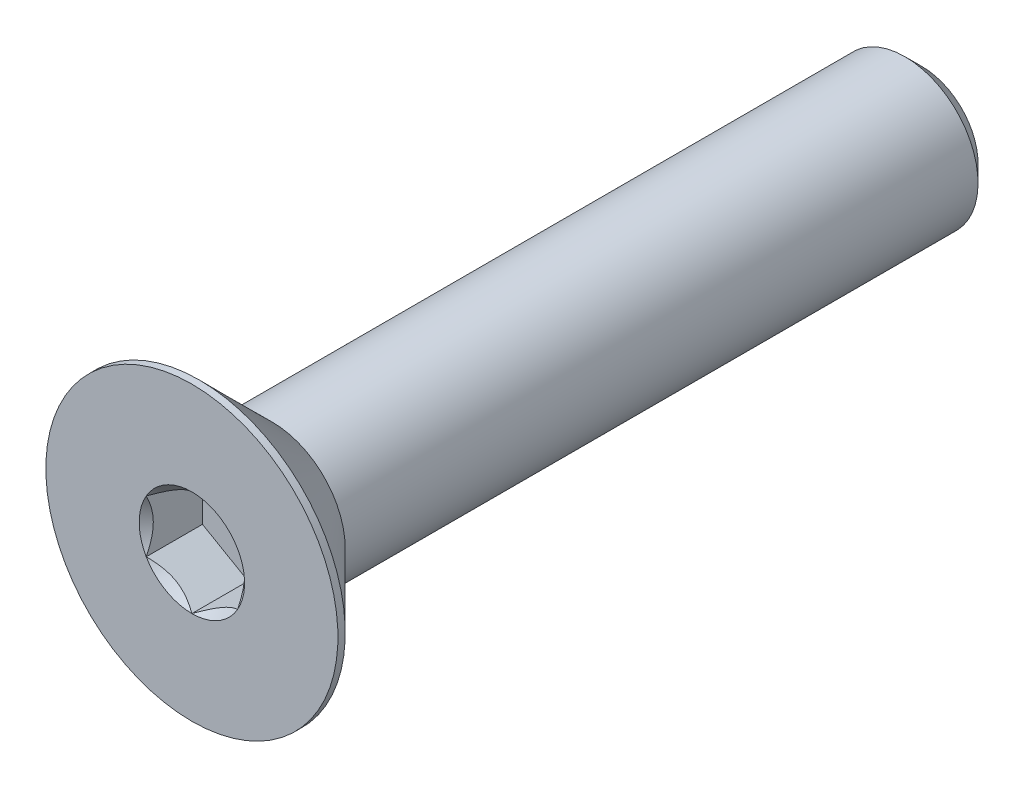
ISO-10303-21;
HEADER;
FILE_DESCRIPTION(('STEP AP214'),'2;1');
FILE_NAME('part.step','',(''),(''),'','','');
FILE_SCHEMA(('AUTOMOTIVE_DESIGN { 1 0 10303 214 1 1 1 1 }'));
ENDSEC;
DATA;
#1=APPLICATION_CONTEXT('core data for automotive mechanical design processes');
#2=APPLICATION_PROTOCOL_DEFINITION('international standard','automotive_design',2000,#1);
#3=PRODUCT_CONTEXT('',#1,'mechanical');
#4=PRODUCT('Part','Part','',(#3));
#5=PRODUCT_RELATED_PRODUCT_CATEGORY('part','',(#4));
#6=PRODUCT_DEFINITION_FORMATION('','',#4);
#7=PRODUCT_DEFINITION_CONTEXT('part definition',#1,'design');
#8=PRODUCT_DEFINITION('design','',#6,#7);
#9=PRODUCT_DEFINITION_SHAPE('','',#8);
#10=(LENGTH_UNIT() NAMED_UNIT(*) SI_UNIT(.MILLI.,.METRE.));
#11=(NAMED_UNIT(*) PLANE_ANGLE_UNIT() SI_UNIT($,.RADIAN.));
#12=(NAMED_UNIT(*) SI_UNIT($,.STERADIAN.) SOLID_ANGLE_UNIT());
#13=UNCERTAINTY_MEASURE_WITH_UNIT(LENGTH_MEASURE(1.E-05),#10,'distance_accuracy_value','');
#14=(GEOMETRIC_REPRESENTATION_CONTEXT(3) GLOBAL_UNCERTAINTY_ASSIGNED_CONTEXT((#13)) GLOBAL_UNIT_ASSIGNED_CONTEXT((#10,
#11,#12)) REPRESENTATION_CONTEXT('',''));
#15=CARTESIAN_POINT('',(0.,0.,0.));
#16=DIRECTION('',(0.,0.,1.));
#17=DIRECTION('',(1.,0.,0.));
#18=AXIS2_PLACEMENT_3D('',#15,#16,#17);
#19=CARTESIAN_POINT('',(0.,0.,-40.));
#20=DIRECTION('',(0.,0.,-1.));
#21=DIRECTION('',(0.,1.,0.));
#22=AXIS2_PLACEMENT_3D('',#19,#20,#21);
#23=CYLINDRICAL_SURFACE('',#22,4.);
#24=CARTESIAN_POINT('',(0.,0.,-39.0625));
#25=DIRECTION('',(0.,0.,-1.));
#26=DIRECTION('',(0.,1.,0.));
#27=AXIS2_PLACEMENT_3D('',#24,#25,#26);
#28=CIRCLE('',#27,4.);
#29=CARTESIAN_POINT('',(0.,4.,-39.0625));
#30=VERTEX_POINT('',#29);
#31=EDGE_CURVE('E51',#30,#30,#28,.F.);
#32=ORIENTED_EDGE('',*,*,#31,.T.);
#33=EDGE_LOOP('',(#32));
#34=FACE_BOUND('',#33,.T.);
#35=CARTESIAN_POINT('',(0.,0.,-4.4));
#36=DIRECTION('',(0.,0.,1.));
#37=DIRECTION('',(0.,-1.,0.));
#38=AXIS2_PLACEMENT_3D('',#35,#36,#37);
#39=CIRCLE('',#38,4.00000000000001);
#40=CARTESIAN_POINT('',(0.,-4.00000000000001,-4.39999999999999));
#41=VERTEX_POINT('',#40);
#42=EDGE_CURVE('E169',#41,#41,#39,.T.);
#43=ORIENTED_EDGE('',*,*,#42,.F.);
#44=EDGE_LOOP('',(#43));
#45=FACE_BOUND('',#44,.T.);
#46=ADVANCED_FACE('F37',(#34,#45),#23,.T.);
#47=CARTESIAN_POINT('',(0.,-4.,-40.));
#48=DIRECTION('',(0.,0.,-1.));
#49=DIRECTION('',(0.,1.,0.));
#50=AXIS2_PLACEMENT_3D('',#47,#48,#49);
#51=PLANE('',#50);
#52=CARTESIAN_POINT('',(0.,0.,-40.));
#53=DIRECTION('',(0.,0.,-1.));
#54=DIRECTION('',(0.,1.,0.));
#55=AXIS2_PLACEMENT_3D('',#52,#53,#54);
#56=CIRCLE('',#55,3.0625);
#57=CARTESIAN_POINT('',(0.,3.0625,-40.));
#58=VERTEX_POINT('',#57);
#59=EDGE_CURVE('E178',#58,#58,#56,.T.);
#60=ORIENTED_EDGE('',*,*,#59,.T.);
#61=EDGE_LOOP('',(#60));
#62=FACE_BOUND('',#61,.T.);
#63=ADVANCED_FACE('F188',(#62),#51,.T.);
#64=CARTESIAN_POINT('',(0.,0.,-40.));
#65=DIRECTION('',(0.,0.,1.));
#66=DIRECTION('',(0.,-1.,0.));
#67=AXIS2_PLACEMENT_3D('',#64,#65,#66);
#68=CONICAL_SURFACE('',#67,3.0625,0.785398163397445);
#69=ORIENTED_EDGE('',*,*,#31,.F.);
#70=EDGE_LOOP('',(#69));
#71=FACE_BOUND('',#70,.T.);
#72=ORIENTED_EDGE('',*,*,#59,.F.);
#73=EDGE_LOOP('',(#72));
#74=FACE_BOUND('',#73,.T.);
#75=ADVANCED_FACE('F39',(#71,#74),#68,.T.);
#76=CARTESIAN_POINT('',(0.,0.,0.));
#77=DIRECTION('',(0.,0.,1.));
#78=DIRECTION('',(0.,-1.,0.));
#79=AXIS2_PLACEMENT_3D('',#76,#77,#78);
#80=CYLINDRICAL_SURFACE('',#79,8.);
#81=CARTESIAN_POINT('',(0.,0.,0.));
#82=DIRECTION('',(0.,0.,1.));
#83=DIRECTION('',(0.,-1.,0.));
#84=AXIS2_PLACEMENT_3D('',#81,#82,#83);
#85=CIRCLE('',#84,8.);
#86=CARTESIAN_POINT('',(0.,-8.,0.));
#87=VERTEX_POINT('',#86);
#88=EDGE_CURVE('E175',#87,#87,#85,.T.);
#89=ORIENTED_EDGE('',*,*,#88,.F.);
#90=EDGE_LOOP('',(#89));
#91=FACE_BOUND('',#90,.T.);
#92=CARTESIAN_POINT('',(0.,0.,-0.400000000000014));
#93=DIRECTION('',(0.,0.,1.));
#94=DIRECTION('',(0.,-1.,0.));
#95=AXIS2_PLACEMENT_3D('',#92,#93,#94);
#96=CIRCLE('',#95,8.);
#97=CARTESIAN_POINT('',(0.,-8.,-0.400000000000006));
#98=VERTEX_POINT('',#97);
#99=EDGE_CURVE('E172',#98,#98,#96,.T.);
#100=ORIENTED_EDGE('',*,*,#99,.T.);
#101=EDGE_LOOP('',(#100));
#102=FACE_BOUND('',#101,.T.);
#103=ADVANCED_FACE('F187',(#91,#102),#80,.T.);
#104=CARTESIAN_POINT('',(0.,0.,-4.4));
#105=DIRECTION('',(0.,0.,1.));
#106=DIRECTION('',(0.,-1.,0.));
#107=AXIS2_PLACEMENT_3D('',#104,#105,#106);
#108=CONICAL_SURFACE('',#107,4.00000000000001,0.785398163397449);
#109=ORIENTED_EDGE('',*,*,#99,.F.);
#110=EDGE_LOOP('',(#109));
#111=FACE_BOUND('',#110,.T.);
#112=ORIENTED_EDGE('',*,*,#42,.T.);
#113=EDGE_LOOP('',(#112));
#114=FACE_BOUND('',#113,.T.);
#115=ADVANCED_FACE('F198',(#111,#114),#108,.T.);
#116=CARTESIAN_POINT('',(0.,-4.,0.));
#117=DIRECTION('',(0.,0.,1.));
#118=DIRECTION('',(0.,-1.,0.));
#119=AXIS2_PLACEMENT_3D('',#116,#117,#118);
#120=PLANE('',#119);
#121=CARTESIAN_POINT('',(0.,0.,0.));
#122=DIRECTION('',(0.,0.,1.));
#123=DIRECTION('',(1.,0.,0.));
#124=AXIS2_PLACEMENT_3D('',#121,#122,#123);
#125=CIRCLE('',#124,2.88675134594813);
#126=CARTESIAN_POINT('',(0.,-2.88675134594813,0.));
#127=VERTEX_POINT('',#126);
#128=CARTESIAN_POINT('',(2.5,-1.44337567297407,0.));
#129=VERTEX_POINT('',#128);
#130=EDGE_CURVE('E97',#127,#129,#125,.T.);
#131=ORIENTED_EDGE('',*,*,#130,.F.);
#132=CARTESIAN_POINT('',(-2.5,-1.44337567297406,0.));
#133=VERTEX_POINT('',#132);
#134=EDGE_CURVE('E57',#133,#127,#125,.T.);
#135=ORIENTED_EDGE('',*,*,#134,.F.);
#136=CARTESIAN_POINT('',(-2.5,1.44337567297407,0.));
#137=VERTEX_POINT('',#136);
#138=EDGE_CURVE('E139',#137,#133,#125,.T.);
#139=ORIENTED_EDGE('',*,*,#138,.F.);
#140=CARTESIAN_POINT('',(0.,2.88675134594813,0.));
#141=VERTEX_POINT('',#140);
#142=EDGE_CURVE('E64',#141,#137,#125,.T.);
#143=ORIENTED_EDGE('',*,*,#142,.F.);
#144=CARTESIAN_POINT('',(2.5,1.44337567297407,0.));
#145=VERTEX_POINT('',#144);
#146=EDGE_CURVE('E133',#145,#141,#125,.T.);
#147=ORIENTED_EDGE('',*,*,#146,.F.);
#148=EDGE_CURVE('E105',#129,#145,#125,.T.);
#149=ORIENTED_EDGE('',*,*,#148,.F.);
#150=EDGE_LOOP('',(#131,#135,#139,#143,#147,#149));
#151=FACE_BOUND('',#150,.T.);
#152=ORIENTED_EDGE('',*,*,#88,.T.);
#153=EDGE_LOOP('',(#152));
#154=FACE_BOUND('',#153,.T.);
#155=ADVANCED_FACE('F131',(#151,#154),#120,.T.);
#156=CARTESIAN_POINT('',(0.,0.,0.));
#157=DIRECTION('',(0.,0.,1.));
#158=DIRECTION('',(1.,0.,0.));
#159=AXIS2_PLACEMENT_3D('',#156,#157,#158);
#160=CONICAL_SURFACE('',#159,2.88675134594813,0.78539816339745);
#161=ORIENTED_EDGE('',*,*,#148,.T.);
#162=CARTESIAN_POINT('',(2.5,-2.87868021616155,0.925964193784654));
#163=CARTESIAN_POINT('',(2.5,-2.80858751756355,0.873054769399493));
#164=CARTESIAN_POINT('',(2.5,-2.73810237384458,0.820656784806447));
#165=CARTESIAN_POINT('',(2.5,-2.5961923890747,0.71711268351522));
#166=CARTESIAN_POINT('',(2.5,-2.52476731657143,0.665966884377933));
#167=CARTESIAN_POINT('',(2.5,-2.38030019419698,0.564792497981435));
#168=CARTESIAN_POINT('',(2.5,-2.307249903594,0.514775637784461));
#169=CARTESIAN_POINT('',(2.5,-2.15990937397294,0.416608843915507));
#170=CARTESIAN_POINT('',(2.5,-2.08561922308943,0.368458778345536));
#171=CARTESIAN_POINT('',(2.5,-1.93130274871409,0.271746559451961));
#172=CARTESIAN_POINT('',(2.5,-1.8511916849785,0.223318932537291));
#173=CARTESIAN_POINT('',(2.5,-1.68912282627168,0.129664059704143));
#174=CARTESIAN_POINT('',(2.5,-1.60716527674864,0.0844363916948275));
#175=CARTESIAN_POINT('',(2.5,-1.44137668632319,-0.00186462533073079));
#176=CARTESIAN_POINT('',(2.5,-1.35755175925796,-0.0429496273364141));
#177=CARTESIAN_POINT('',(2.5,-1.18761577759421,-0.120038133893406));
#178=CARTESIAN_POINT('',(2.5,-1.10150577924729,-0.156043939265442));
#179=CARTESIAN_POINT('',(2.5,-0.933895283730375,-0.219050255714909));
#180=CARTESIAN_POINT('',(2.5,-0.852581486652413,-0.246542279856904));
#181=CARTESIAN_POINT('',(2.5,-0.687996185051426,-0.295002885582604));
#182=CARTESIAN_POINT('',(2.5,-0.604724546085164,-0.315971017761044));
#183=CARTESIAN_POINT('',(2.5,-0.43810578650165,-0.34994000498697));
#184=CARTESIAN_POINT('',(2.5,-0.354786957377882,-0.36307736655639));
#185=CARTESIAN_POINT('',(2.5,-0.187258638268772,-0.381129805600403));
#186=CARTESIAN_POINT('',(2.5,-0.103049303891733,-0.386046296469838));
#187=CARTESIAN_POINT('',(2.5,0.0623819458555491,-0.387291925628103));
#188=CARTESIAN_POINT('',(2.5,0.143601667742494,-0.383925448289118));
#189=CARTESIAN_POINT('',(2.5,0.305344840533964,-0.369462407619086));
#190=CARTESIAN_POINT('',(2.5,0.385868223029657,-0.358365093346909));
#191=CARTESIAN_POINT('',(2.5,0.54699999247773,-0.328857921414663));
#192=CARTESIAN_POINT('',(2.5,0.627585258156379,-0.310323623169082));
#193=CARTESIAN_POINT('',(2.5,0.786991930978587,-0.266927667985934));
#194=CARTESIAN_POINT('',(2.5,0.865813485110824,-0.242066540482563));
#195=CARTESIAN_POINT('',(2.5,1.11399280220491,-0.154441088760137));
#196=CARTESIAN_POINT('',(2.5,1.27984027529456,-0.0816966645253849));
#197=CARTESIAN_POINT('',(2.5,1.52253018655038,0.0395423452678429));
#198=CARTESIAN_POINT('',(2.5,1.60256472908879,0.0820714512072025));
#199=CARTESIAN_POINT('',(2.5,1.76081489282124,0.170396524152191));
#200=CARTESIAN_POINT('',(2.5,1.83903083842887,0.216191902476711));
#201=CARTESIAN_POINT('',(2.5,1.99000684607168,0.308044678728647));
#202=CARTESIAN_POINT('',(2.5,2.06284472030444,0.353975635424457));
#203=CARTESIAN_POINT('',(2.5,2.20727164736135,0.447770245386505));
#204=CARTESIAN_POINT('',(2.5,2.27886060500402,0.495634045043618));
#205=CARTESIAN_POINT('',(2.5,2.42037078548403,0.592552236318333));
#206=CARTESIAN_POINT('',(2.5,2.49030083172878,0.641593798316209));
#207=CARTESIAN_POINT('',(2.5,2.62920524991558,0.74097383518978));
#208=CARTESIAN_POINT('',(2.5,2.69817987937839,0.791311949707407));
#209=CARTESIAN_POINT('',(2.5,2.76675463365823,0.842180297682425));
#210=B_SPLINE_CURVE_WITH_KNOTS('',3,(#162,#163,#164,#165,#166,#167,#168,#169,#170,#171,#172,
#173,#174,#175,#176,#177,#178,#179,#180,#181,#182,#183,#184,#185,#186,#187,#188,#189,#190,#191,
#192,#193,#194,#195,#196,#197,#198,#199,#200,#201,#202,#203,#204,#205,#206,#207,#208,#209),
.UNSPECIFIED.,.F.,.F.,(4,2,2,2,2,2,2,2,2,2,2,2,2,2,2,2,2,2,2,2,2,2,2,4),(0.,0.263465914971114,
0.526997968323237,0.792571943279361,1.05812711983771,1.33890112548018,1.61963802629079,
1.89956181222216,2.17935838571897,2.436638876826,2.69393708705248,2.94660788173135,
3.19923523085016,3.44271854486786,3.68622551313359,3.93398926860573,4.18173229781968,
4.72334004841908,4.99521600382014,5.26704308216966,5.52534341671993,5.78366335141086,
6.03988492204047,6.29603603207541),.UNSPECIFIED.);
#211=EDGE_CURVE('E11',#129,#145,#210,.T.);
#212=ORIENTED_EDGE('',*,*,#211,.F.);
#213=EDGE_LOOP('',(#161,#212));
#214=FACE_BOUND('',#213,.T.);
#215=ADVANCED_FACE('F109',(#214),#160,.F.);
#216=ORIENTED_EDGE('',*,*,#146,.T.);
#217=CARTESIAN_POINT('',(2.5002,1.44326020292023,0.000115476981763761));
#218=CARTESIAN_POINT('',(2.41426172221224,1.49287669073469,-0.049459294645273));
#219=CARTESIAN_POINT('',(2.32688643272425,1.5433228376411,-0.0961225186374943));
#220=CARTESIAN_POINT('',(2.14871854383441,1.64618811625259,-0.181561859961699));
#221=CARTESIAN_POINT('',(2.05790899931893,1.6986170312236,-0.220290437593998));
#222=CARTESIAN_POINT('',(1.87479587687308,1.80433744175986,-0.286633296102261));
#223=CARTESIAN_POINT('',(1.78253893547066,1.85760201171316,-0.314414331469144));
#224=CARTESIAN_POINT('',(1.59599399122371,1.96530378549009,-0.357216824089333));
#225=CARTESIAN_POINT('',(1.50171168743372,2.01973769896307,-0.372270233328655));
#226=CARTESIAN_POINT('',(1.33922174170816,2.11355131286833,-0.385852277790517));
#227=CARTESIAN_POINT('',(1.27122403211985,2.15280980880341,-0.387862900759198));
#228=CARTESIAN_POINT('',(1.13533975883078,2.23126263056549,-0.384475882812511));
#229=CARTESIAN_POINT('',(1.06745324244776,2.27045692907358,-0.379075644700179));
#230=CARTESIAN_POINT('',(0.932321211763894,2.34847544336505,-0.361174211597527));
#231=CARTESIAN_POINT('',(0.86507650024644,2.38729919566123,-0.348665072953518));
#232=CARTESIAN_POINT('',(0.731749899181801,2.46427534467604,-0.317232498044292));
#233=CARTESIAN_POINT('',(0.665667920900343,2.50242779262542,-0.298309553503181));
#234=CARTESIAN_POINT('',(0.496403653308736,2.60015256308362,-0.242132638591752));
#235=CARTESIAN_POINT('',(0.394270877777108,2.65911894852989,-0.200644168403812));
#236=CARTESIAN_POINT('',(0.244093585059492,2.74582384890657,-0.130605953276912));
#237=CARTESIAN_POINT('',(0.194603460117391,2.77439698586412,-0.105997747883926));
#238=CARTESIAN_POINT('',(0.0965399361611537,2.83101398781794,-0.0545381132847644));
#239=CARTESIAN_POINT('',(0.0479659965030725,2.85905816495513,-0.0276880612206441));
#240=CARTESIAN_POINT('',(-0.000199999999999359,2.88686681600197,0.00011547698176382));
#241=B_SPLINE_CURVE_WITH_KNOTS('',3,(#217,#218,#219,#220,#221,#222,#223,#224,#225,#226,#227,
#228,#229,#230,#231,#232,#233,#234,#235,#236,#237,#238,#239,#240),.UNSPECIFIED.,.F.,.F.,(4,2,2,
2,2,2,2,2,2,2,2,4),(0.,0.333012085133924,0.667964518301397,0.997597032043298,1.32639954393844,
1.56169424147168,1.79707142102083,2.03271213522171,2.26833478775651,2.64260240809533,
2.82922877818864,3.01574133749025),.UNSPECIFIED.);
#242=EDGE_CURVE('E135',#145,#141,#241,.T.);
#243=ORIENTED_EDGE('',*,*,#242,.F.);
#244=EDGE_LOOP('',(#216,#243));
#245=FACE_BOUND('',#244,.T.);
#246=ADVANCED_FACE('F279',(#245),#160,.F.);
#247=ORIENTED_EDGE('',*,*,#142,.T.);
#248=CARTESIAN_POINT('',(0.00020000000000028,2.88686681600197,0.000115476981764065));
#249=CARTESIAN_POINT('',(-0.0857382777877646,2.83725032818751,-0.0494592946452729));
#250=CARTESIAN_POINT('',(-0.173113567275753,2.7868041812811,-0.0961225186374941));
#251=CARTESIAN_POINT('',(-0.351281456165588,2.6839389026696,-0.181561859961699));
#252=CARTESIAN_POINT('',(-0.442091000681074,2.6315099876986,-0.220290437593997));
#253=CARTESIAN_POINT('',(-0.62520412312692,2.52578957716234,-0.286633296102261));
#254=CARTESIAN_POINT('',(-0.71746106452934,2.47252500720904,-0.314414331469143));
#255=CARTESIAN_POINT('',(-0.904006008776286,2.3648232334321,-0.357216824089333));
#256=CARTESIAN_POINT('',(-0.998288312566283,2.31038931995913,-0.372270233328655));
#257=CARTESIAN_POINT('',(-1.16077825829185,2.21657570605387,-0.385852277790517));
#258=CARTESIAN_POINT('',(-1.22877596788015,2.17731721011878,-0.387862900759198));
#259=CARTESIAN_POINT('',(-1.36466024116922,2.0988643883567,-0.384475882812511));
#260=CARTESIAN_POINT('',(-1.43254675755224,2.05967008984862,-0.379075644700178));
#261=CARTESIAN_POINT('',(-1.5676787882361,1.98165157555715,-0.361174211597527));
#262=CARTESIAN_POINT('',(-1.63492349975356,1.94282782326097,-0.348665072953518));
#263=CARTESIAN_POINT('',(-1.7682501008182,1.86585167424616,-0.317232498044292));
#264=CARTESIAN_POINT('',(-1.83433207909966,1.82769922629678,-0.298309553503181));
#265=CARTESIAN_POINT('',(-2.00359634669126,1.72997445583858,-0.242132638591752));
#266=CARTESIAN_POINT('',(-2.10572912222289,1.67100807039231,-0.200644168403812));
#267=CARTESIAN_POINT('',(-2.25590641494051,1.58430317001562,-0.130605953276911));
#268=CARTESIAN_POINT('',(-2.30539653988261,1.55573003305807,-0.105997747883925));
#269=CARTESIAN_POINT('',(-2.40346006383885,1.49911303110426,-0.0545381132847639));
#270=CARTESIAN_POINT('',(-2.45203400349693,1.47106885396706,-0.0276880612206436));
#271=CARTESIAN_POINT('',(-2.5002,1.44326020292023,0.00011547698176428));
#272=B_SPLINE_CURVE_WITH_KNOTS('',3,(#248,#249,#250,#251,#252,#253,#254,#255,#256,#257,#258,
#259,#260,#261,#262,#263,#264,#265,#266,#267,#268,#269,#270,#271),.UNSPECIFIED.,.F.,.F.,(4,2,2,
2,2,2,2,2,2,2,2,4),(0.,0.333012085133924,0.667964518301397,0.997597032043299,1.32639954393844,
1.56169424147169,1.79707142102083,2.03271213522171,2.2683347877565,2.64260240809533,
2.82922877818864,3.01574133749025),.UNSPECIFIED.);
#273=EDGE_CURVE('E138',#141,#137,#272,.T.);
#274=ORIENTED_EDGE('',*,*,#273,.F.);
#275=EDGE_LOOP('',(#247,#274));
#276=FACE_BOUND('',#275,.T.);
#277=ADVANCED_FACE('F275',(#276),#160,.F.);
#278=ORIENTED_EDGE('',*,*,#138,.T.);
#279=CARTESIAN_POINT('',(-2.5,-2.87868021616154,0.925964193784654));
#280=CARTESIAN_POINT('',(-2.5,-2.80858751756355,0.873054769399494));
#281=CARTESIAN_POINT('',(-2.5,-2.73810237384458,0.820656784806447));
#282=CARTESIAN_POINT('',(-2.5,-2.59619238907469,0.71711268351522));
#283=CARTESIAN_POINT('',(-2.5,-2.52476731657143,0.665966884377933));
#284=CARTESIAN_POINT('',(-2.5,-2.38030019419698,0.564792497981435));
#285=CARTESIAN_POINT('',(-2.5,-2.307249903594,0.514775637784462));
#286=CARTESIAN_POINT('',(-2.5,-2.15990937397294,0.416608843915508));
#287=CARTESIAN_POINT('',(-2.5,-2.08561922308943,0.368458778345537));
#288=CARTESIAN_POINT('',(-2.5,-1.93130274871409,0.271746559451961));
#289=CARTESIAN_POINT('',(-2.5,-1.8511916849785,0.223318932537292));
#290=CARTESIAN_POINT('',(-2.5,-1.68912282627168,0.129664059704144));
#291=CARTESIAN_POINT('',(-2.5,-1.60716527674864,0.0844363916948283));
#292=CARTESIAN_POINT('',(-2.5,-1.44137668632319,-0.00186462533072997));
#293=CARTESIAN_POINT('',(-2.5,-1.35755175925796,-0.0429496273364133));
#294=CARTESIAN_POINT('',(-2.5,-1.1876157775942,-0.120038133893405));
#295=CARTESIAN_POINT('',(-2.5,-1.10150577924729,-0.156043939265441));
#296=CARTESIAN_POINT('',(-2.5,-0.933895283730374,-0.219050255714908));
#297=CARTESIAN_POINT('',(-2.5,-0.852581486652411,-0.246542279856903));
#298=CARTESIAN_POINT('',(-2.5,-0.687996185051425,-0.295002885582602));
#299=CARTESIAN_POINT('',(-2.5,-0.604724546085162,-0.315971017761042));
#300=CARTESIAN_POINT('',(-2.5,-0.438105786501648,-0.349940004986968));
#301=CARTESIAN_POINT('',(-2.5,-0.35478695737788,-0.363077366556388));
#302=CARTESIAN_POINT('',(-2.5,-0.187258638268771,-0.381129805600401));
#303=CARTESIAN_POINT('',(-2.5,-0.103049303891732,-0.386046296469837));
#304=CARTESIAN_POINT('',(-2.5,0.06238194585555,-0.387291925628102));
#305=CARTESIAN_POINT('',(-2.5,0.143601667742495,-0.383925448289116));
#306=CARTESIAN_POINT('',(-2.5,0.305344840533965,-0.369462407619084));
#307=CARTESIAN_POINT('',(-2.5,0.385868223029658,-0.358365093346908));
#308=CARTESIAN_POINT('',(-2.5,0.546999992477731,-0.328857921414662));
#309=CARTESIAN_POINT('',(-2.5,0.62758525815638,-0.310323623169081));
#310=CARTESIAN_POINT('',(-2.5,0.786991930978588,-0.266927667985932));
#311=CARTESIAN_POINT('',(-2.5,0.865813485110825,-0.242066540482561));
#312=CARTESIAN_POINT('',(-2.5,1.11399280220491,-0.154441088760136));
#313=CARTESIAN_POINT('',(-2.5,1.27984027529456,-0.0816966645253838));
#314=CARTESIAN_POINT('',(-2.5,1.52253018655038,0.0395423452678443));
#315=CARTESIAN_POINT('',(-2.5,1.60256472908879,0.0820714512072041));
#316=CARTESIAN_POINT('',(-2.5,1.76081489282124,0.170396524152192));
#317=CARTESIAN_POINT('',(-2.5,1.83903083842887,0.216191902476713));
#318=CARTESIAN_POINT('',(-2.5,1.99000684607168,0.308044678728649));
#319=CARTESIAN_POINT('',(-2.5,2.06284472030444,0.353975635424459));
#320=CARTESIAN_POINT('',(-2.5,2.20727164736135,0.447770245386506));
#321=CARTESIAN_POINT('',(-2.5,2.27886060500402,0.49563404504362));
#322=CARTESIAN_POINT('',(-2.5,2.42037078548403,0.592552236318334));
#323=CARTESIAN_POINT('',(-2.5,2.49030083172878,0.64159379831621));
#324=CARTESIAN_POINT('',(-2.5,2.62920524991558,0.740973835189781));
#325=CARTESIAN_POINT('',(-2.5,2.69817987937839,0.791311949707409));
#326=CARTESIAN_POINT('',(-2.5,2.76675463365823,0.842180297682427));
#327=B_SPLINE_CURVE_WITH_KNOTS('',3,(#279,#280,#281,#282,#283,#284,#285,#286,#287,#288,#289,
#290,#291,#292,#293,#294,#295,#296,#297,#298,#299,#300,#301,#302,#303,#304,#305,#306,#307,#308,
#309,#310,#311,#312,#313,#314,#315,#316,#317,#318,#319,#320,#321,#322,#323,#324,#325,#326),
.UNSPECIFIED.,.F.,.F.,(4,2,2,2,2,2,2,2,2,2,2,2,2,2,2,2,2,2,2,2,2,2,2,4),(0.,0.263465914971114,
0.526997968323237,0.79257194327936,1.05812711983771,1.33890112548018,1.61963802629079,
1.89956181222216,2.17935838571897,2.436638876826,2.69393708705248,2.94660788173135,
3.19923523085016,3.44271854486786,3.68622551313359,3.93398926860573,4.18173229781968,
4.72334004841908,4.99521600382014,5.26704308216966,5.52534341671993,5.78366335141086,
6.03988492204046,6.29603603207541),.UNSPECIFIED.);
#328=EDGE_CURVE('E145',#137,#133,#327,.F.);
#329=ORIENTED_EDGE('',*,*,#328,.F.);
#330=EDGE_LOOP('',(#278,#329));
#331=FACE_BOUND('',#330,.T.);
#332=ADVANCED_FACE('F143',(#331),#160,.F.);
#333=ORIENTED_EDGE('',*,*,#134,.T.);
#334=CARTESIAN_POINT('',(-2.5002,-1.44326020292023,0.000115476981764195));
#335=CARTESIAN_POINT('',(-2.41426172221224,-1.49287669073469,-0.0494592946452733));
#336=CARTESIAN_POINT('',(-2.32688643272425,-1.5433228376411,-0.0961225186374948));
#337=CARTESIAN_POINT('',(-2.14871854383441,-1.64618811625259,-0.181561859961699));
#338=CARTESIAN_POINT('',(-2.05790899931893,-1.69861703122359,-0.220290437593998));
#339=CARTESIAN_POINT('',(-1.87479587687308,-1.80433744175986,-0.286633296102262));
#340=CARTESIAN_POINT('',(-1.78253893547066,-1.85760201171316,-0.314414331469144));
#341=CARTESIAN_POINT('',(-1.59599399122371,-1.96530378549009,-0.357216824089334));
#342=CARTESIAN_POINT('',(-1.50171168743372,-2.01973769896307,-0.372270233328656));
#343=CARTESIAN_POINT('',(-1.33922174170815,-2.11355131286833,-0.385852277790518));
#344=CARTESIAN_POINT('',(-1.27122403211985,-2.15280980880341,-0.387862900759198));
#345=CARTESIAN_POINT('',(-1.13533975883078,-2.23126263056549,-0.384475882812511));
#346=CARTESIAN_POINT('',(-1.06745324244776,-2.27045692907358,-0.379075644700179));
#347=CARTESIAN_POINT('',(-0.932321211763892,-2.34847544336505,-0.361174211597527));
#348=CARTESIAN_POINT('',(-0.865076500246437,-2.38729919566123,-0.348665072953518));
#349=CARTESIAN_POINT('',(-0.731749899181799,-2.46427534467604,-0.317232498044291));
#350=CARTESIAN_POINT('',(-0.665667920900341,-2.50242779262542,-0.29830955350318));
#351=CARTESIAN_POINT('',(-0.496403653308733,-2.60015256308362,-0.242132638591751));
#352=CARTESIAN_POINT('',(-0.394270877777106,-2.65911894852989,-0.200644168403811));
#353=CARTESIAN_POINT('',(-0.244093585059491,-2.74582384890657,-0.130605953276911));
#354=CARTESIAN_POINT('',(-0.19460346011739,-2.77439698586412,-0.105997747883925));
#355=CARTESIAN_POINT('',(-0.0965399361611535,-2.83101398781794,-0.0545381132847639));
#356=CARTESIAN_POINT('',(-0.0479659965030725,-2.85905816495513,-0.0276880612206438));
#357=CARTESIAN_POINT('',(0.000199999999999585,-2.88686681600197,0.000115476981763892));
#358=B_SPLINE_CURVE_WITH_KNOTS('',3,(#334,#335,#336,#337,#338,#339,#340,#341,#342,#343,#344,
#345,#346,#347,#348,#349,#350,#351,#352,#353,#354,#355,#356,#357),.UNSPECIFIED.,.F.,.F.,(4,2,2,
2,2,2,2,2,2,2,2,4),(0.,0.333012085133924,0.667964518301398,0.997597032043301,1.32639954393845,
1.56169424147169,1.79707142102083,2.03271213522171,2.26833478775651,2.64260240809533,
2.82922877818864,3.01574133749025),.UNSPECIFIED.);
#359=EDGE_CURVE('E121',#133,#127,#358,.T.);
#360=ORIENTED_EDGE('',*,*,#359,.F.);
#361=EDGE_LOOP('',(#333,#360));
#362=FACE_BOUND('',#361,.T.);
#363=ADVANCED_FACE('F227',(#362),#160,.F.);
#364=ORIENTED_EDGE('',*,*,#130,.T.);
#365=CARTESIAN_POINT('',(-0.00020000000000026,-2.88686681600197,0.000115476981764065));
#366=CARTESIAN_POINT('',(0.0857382777877645,-2.83725032818751,-0.0494592946452727));
#367=CARTESIAN_POINT('',(0.173113567275753,-2.7868041812811,-0.0961225186374941));
#368=CARTESIAN_POINT('',(0.351281456165588,-2.6839389026696,-0.181561859961699));
#369=CARTESIAN_POINT('',(0.442091000681074,-2.6315099876986,-0.220290437593998));
#370=CARTESIAN_POINT('',(0.62520412312692,-2.52578957716234,-0.286633296102261));
#371=CARTESIAN_POINT('',(0.71746106452934,-2.47252500720904,-0.314414331469143));
#372=CARTESIAN_POINT('',(0.904006008776286,-2.3648232334321,-0.357216824089333));
#373=CARTESIAN_POINT('',(0.998288312566283,-2.31038931995913,-0.372270233328655));
#374=CARTESIAN_POINT('',(1.16077825829185,-2.21657570605387,-0.385852277790518));
#375=CARTESIAN_POINT('',(1.22877596788015,-2.17731721011878,-0.387862900759198));
#376=CARTESIAN_POINT('',(1.36466024116922,-2.0988643883567,-0.384475882812511));
#377=CARTESIAN_POINT('',(1.43254675755224,-2.05967008984862,-0.379075644700179));
#378=CARTESIAN_POINT('',(1.56767878823611,-1.98165157555715,-0.361174211597527));
#379=CARTESIAN_POINT('',(1.63492349975356,-1.94282782326097,-0.348665072953518));
#380=CARTESIAN_POINT('',(1.7682501008182,-1.86585167424616,-0.317232498044291));
#381=CARTESIAN_POINT('',(1.83433207909966,-1.82769922629678,-0.29830955350318));
#382=CARTESIAN_POINT('',(2.00359634669126,-1.72997445583858,-0.242132638591752));
#383=CARTESIAN_POINT('',(2.10572912222289,-1.67100807039231,-0.200644168403812));
#384=CARTESIAN_POINT('',(2.25590641494051,-1.58430317001562,-0.130605953276911));
#385=CARTESIAN_POINT('',(2.30539653988261,-1.55573003305807,-0.105997747883926));
#386=CARTESIAN_POINT('',(2.40346006383885,-1.49911303110426,-0.0545381132847643));
#387=CARTESIAN_POINT('',(2.45203400349693,-1.47106885396706,-0.0276880612206441));
#388=CARTESIAN_POINT('',(2.5002,-1.44326020292023,0.000115476981763465));
#389=B_SPLINE_CURVE_WITH_KNOTS('',3,(#365,#366,#367,#368,#369,#370,#371,#372,#373,#374,#375,
#376,#377,#378,#379,#380,#381,#382,#383,#384,#385,#386,#387,#388),.UNSPECIFIED.,.F.,.F.,(4,2,2,
2,2,2,2,2,2,2,2,4),(0.,0.333012085133924,0.667964518301397,0.997597032043299,1.32639954393844,
1.56169424147169,1.79707142102083,2.03271213522171,2.26833478775651,2.64260240809533,
2.82922877818864,3.01574133749025),.UNSPECIFIED.);
#390=EDGE_CURVE('E101',#127,#129,#389,.T.);
#391=ORIENTED_EDGE('',*,*,#390,.F.);
#392=EDGE_LOOP('',(#364,#391));
#393=FACE_BOUND('',#392,.T.);
#394=ADVANCED_FACE('F99',(#393),#160,.F.);
#395=CARTESIAN_POINT('',(2.5,-1.44337567297407,-3.08));
#396=DIRECTION('',(0.,0.,1.));
#397=DIRECTION('',(1.,0.,0.));
#398=AXIS2_PLACEMENT_3D('',#395,#396,#397);
#399=PLANE('',#398);
#400=DIRECTION('',(0.866025403784439,0.5,0.));
#401=VECTOR('',#400,1.);
#402=CARTESIAN_POINT('',(0.,-2.88675134594813,-3.08));
#403=LINE('',#402,#401);
#404=CARTESIAN_POINT('',(0.,-2.88675134594813,-3.08));
#405=VERTEX_POINT('',#404);
#406=CARTESIAN_POINT('',(2.5,-1.44337567297407,-3.08));
#407=VERTEX_POINT('',#406);
#408=EDGE_CURVE('E120',#405,#407,#403,.T.);
#409=ORIENTED_EDGE('',*,*,#408,.T.);
#410=DIRECTION('',(0.,1.,0.));
#411=VECTOR('',#410,1.);
#412=CARTESIAN_POINT('',(2.5,-1.44337567297407,-3.08));
#413=LINE('',#412,#411);
#414=CARTESIAN_POINT('',(2.5,1.44337567297407,-3.08));
#415=VERTEX_POINT('',#414);
#416=EDGE_CURVE('E125',#407,#415,#413,.T.);
#417=ORIENTED_EDGE('',*,*,#416,.T.);
#418=DIRECTION('',(-0.866025403784439,0.5,0.));
#419=VECTOR('',#418,1.);
#420=CARTESIAN_POINT('',(2.5,1.44337567297407,-3.08));
#421=LINE('',#420,#419);
#422=CARTESIAN_POINT('',(0.,2.88675134594813,-3.08));
#423=VERTEX_POINT('',#422);
#424=EDGE_CURVE('E261',#415,#423,#421,.T.);
#425=ORIENTED_EDGE('',*,*,#424,.T.);
#426=DIRECTION('',(-0.866025403784439,-0.5,0.));
#427=VECTOR('',#426,1.);
#428=CARTESIAN_POINT('',(0.,2.88675134594813,-3.08));
#429=LINE('',#428,#427);
#430=CARTESIAN_POINT('',(-2.5,1.44337567297407,-3.08));
#431=VERTEX_POINT('',#430);
#432=EDGE_CURVE('E263',#423,#431,#429,.T.);
#433=ORIENTED_EDGE('',*,*,#432,.T.);
#434=DIRECTION('',(0.,-1.,0.));
#435=VECTOR('',#434,1.);
#436=CARTESIAN_POINT('',(-2.5,1.44337567297407,-3.08));
#437=LINE('',#436,#435);
#438=CARTESIAN_POINT('',(-2.5,-1.44337567297406,-3.08));
#439=VERTEX_POINT('',#438);
#440=EDGE_CURVE('E160',#431,#439,#437,.T.);
#441=ORIENTED_EDGE('',*,*,#440,.T.);
#442=DIRECTION('',(0.866025403784439,-0.5,0.));
#443=VECTOR('',#442,1.);
#444=CARTESIAN_POINT('',(-2.5,-1.44337567297406,-3.08));
#445=LINE('',#444,#443);
#446=EDGE_CURVE('E128',#439,#405,#445,.T.);
#447=ORIENTED_EDGE('',*,*,#446,.T.);
#448=EDGE_LOOP('',(#409,#417,#425,#433,#441,#447));
#449=FACE_BOUND('',#448,.T.);
#450=ADVANCED_FACE('F226',(#449),#399,.T.);
#451=CARTESIAN_POINT('',(2.5,-1.44337567297407,-3.08));
#452=DIRECTION('',(1.,0.,0.));
#453=DIRECTION('',(0.,1.,0.));
#454=AXIS2_PLACEMENT_3D('',#451,#452,#453);
#455=PLANE('',#454);
#456=DIRECTION('',(0.,0.,1.));
#457=VECTOR('',#456,1.);
#458=CARTESIAN_POINT('',(2.5,-1.44337567297407,-3.08));
#459=LINE('',#458,#457);
#460=EDGE_CURVE('E117',#407,#129,#459,.T.);
#461=ORIENTED_EDGE('',*,*,#460,.T.);
#462=ORIENTED_EDGE('',*,*,#211,.T.);
#463=DIRECTION('',(0.,0.,1.));
#464=VECTOR('',#463,1.);
#465=CARTESIAN_POINT('',(2.5,1.44337567297407,-3.08));
#466=LINE('',#465,#464);
#467=EDGE_CURVE('E127',#415,#145,#466,.T.);
#468=ORIENTED_EDGE('',*,*,#467,.F.);
#469=ORIENTED_EDGE('',*,*,#416,.F.);
#470=EDGE_LOOP('',(#461,#462,#468,#469));
#471=FACE_BOUND('',#470,.T.);
#472=ADVANCED_FACE('F123',(#471),#455,.F.);
#473=CARTESIAN_POINT('',(2.5,1.44337567297407,-3.08));
#474=DIRECTION('',(0.5,0.866025403784439,0.));
#475=DIRECTION('',(-0.866025403784439,0.5,0.));
#476=AXIS2_PLACEMENT_3D('',#473,#474,#475);
#477=PLANE('',#476);
#478=ORIENTED_EDGE('',*,*,#467,.T.);
#479=ORIENTED_EDGE('',*,*,#242,.T.);
#480=DIRECTION('',(0.,0.,1.));
#481=VECTOR('',#480,1.);
#482=CARTESIAN_POINT('',(0.,2.88675134594813,-3.08));
#483=LINE('',#482,#481);
#484=EDGE_CURVE('E156',#423,#141,#483,.T.);
#485=ORIENTED_EDGE('',*,*,#484,.F.);
#486=ORIENTED_EDGE('',*,*,#424,.F.);
#487=EDGE_LOOP('',(#478,#479,#485,#486));
#488=FACE_BOUND('',#487,.T.);
#489=ADVANCED_FACE('F252',(#488),#477,.F.);
#490=CARTESIAN_POINT('',(0.,2.88675134594813,-3.08));
#491=DIRECTION('',(-0.5,0.866025403784439,0.));
#492=DIRECTION('',(-0.866025403784439,-0.5,0.));
#493=AXIS2_PLACEMENT_3D('',#490,#491,#492);
#494=PLANE('',#493);
#495=ORIENTED_EDGE('',*,*,#484,.T.);
#496=ORIENTED_EDGE('',*,*,#273,.T.);
#497=DIRECTION('',(0.,0.,1.));
#498=VECTOR('',#497,1.);
#499=CARTESIAN_POINT('',(-2.5,1.44337567297407,-3.08));
#500=LINE('',#499,#498);
#501=EDGE_CURVE('E154',#431,#137,#500,.T.);
#502=ORIENTED_EDGE('',*,*,#501,.F.);
#503=ORIENTED_EDGE('',*,*,#432,.F.);
#504=EDGE_LOOP('',(#495,#496,#502,#503));
#505=FACE_BOUND('',#504,.T.);
#506=ADVANCED_FACE('F152',(#505),#494,.F.);
#507=CARTESIAN_POINT('',(-2.5,1.44337567297407,-3.08));
#508=DIRECTION('',(-1.,0.,0.));
#509=DIRECTION('',(0.,0.,1.));
#510=AXIS2_PLACEMENT_3D('',#507,#508,#509);
#511=PLANE('',#510);
#512=ORIENTED_EDGE('',*,*,#501,.T.);
#513=ORIENTED_EDGE('',*,*,#328,.T.);
#514=DIRECTION('',(0.,0.,1.));
#515=VECTOR('',#514,1.);
#516=CARTESIAN_POINT('',(-2.5,-1.44337567297406,-3.08));
#517=LINE('',#516,#515);
#518=EDGE_CURVE('E162',#439,#133,#517,.T.);
#519=ORIENTED_EDGE('',*,*,#518,.F.);
#520=ORIENTED_EDGE('',*,*,#440,.F.);
#521=EDGE_LOOP('',(#512,#513,#519,#520));
#522=FACE_BOUND('',#521,.T.);
#523=ADVANCED_FACE('F158',(#522),#511,.F.);
#524=CARTESIAN_POINT('',(-2.5,-1.44337567297406,-3.08));
#525=DIRECTION('',(-0.5,-0.866025403784439,0.));
#526=DIRECTION('',(0.866025403784439,-0.5,0.));
#527=AXIS2_PLACEMENT_3D('',#524,#525,#526);
#528=PLANE('',#527);
#529=ORIENTED_EDGE('',*,*,#518,.T.);
#530=ORIENTED_EDGE('',*,*,#359,.T.);
#531=DIRECTION('',(0.,0.,1.));
#532=VECTOR('',#531,1.);
#533=CARTESIAN_POINT('',(0.,-2.88675134594813,-3.08));
#534=LINE('',#533,#532);
#535=EDGE_CURVE('E119',#405,#127,#534,.T.);
#536=ORIENTED_EDGE('',*,*,#535,.F.);
#537=ORIENTED_EDGE('',*,*,#446,.F.);
#538=EDGE_LOOP('',(#529,#530,#536,#537));
#539=FACE_BOUND('',#538,.T.);
#540=ADVANCED_FACE('F208',(#539),#528,.F.);
#541=CARTESIAN_POINT('',(0.,-2.88675134594813,-3.08));
#542=DIRECTION('',(0.5,-0.866025403784439,0.));
#543=DIRECTION('',(0.866025403784439,0.5,0.));
#544=AXIS2_PLACEMENT_3D('',#541,#542,#543);
#545=PLANE('',#544);
#546=ORIENTED_EDGE('',*,*,#535,.T.);
#547=ORIENTED_EDGE('',*,*,#390,.T.);
#548=ORIENTED_EDGE('',*,*,#460,.F.);
#549=ORIENTED_EDGE('',*,*,#408,.F.);
#550=EDGE_LOOP('',(#546,#547,#548,#549));
#551=FACE_BOUND('',#550,.T.);
#552=ADVANCED_FACE('F115',(#551),#545,.F.);
#553=CLOSED_SHELL('',(#46,#63,#75,#103,#115,#155,#215,#246,#277,#332,#363,#394,#450,#472,#489,
#506,#523,#540,#552));
#554=MANIFOLD_SOLID_BREP('B2',#553);
#555=ADVANCED_BREP_SHAPE_REPRESENTATION('',(#18,#554),#14);
#556=SHAPE_DEFINITION_REPRESENTATION(#9,#555);
ENDSEC;
END-ISO-10303-21;
